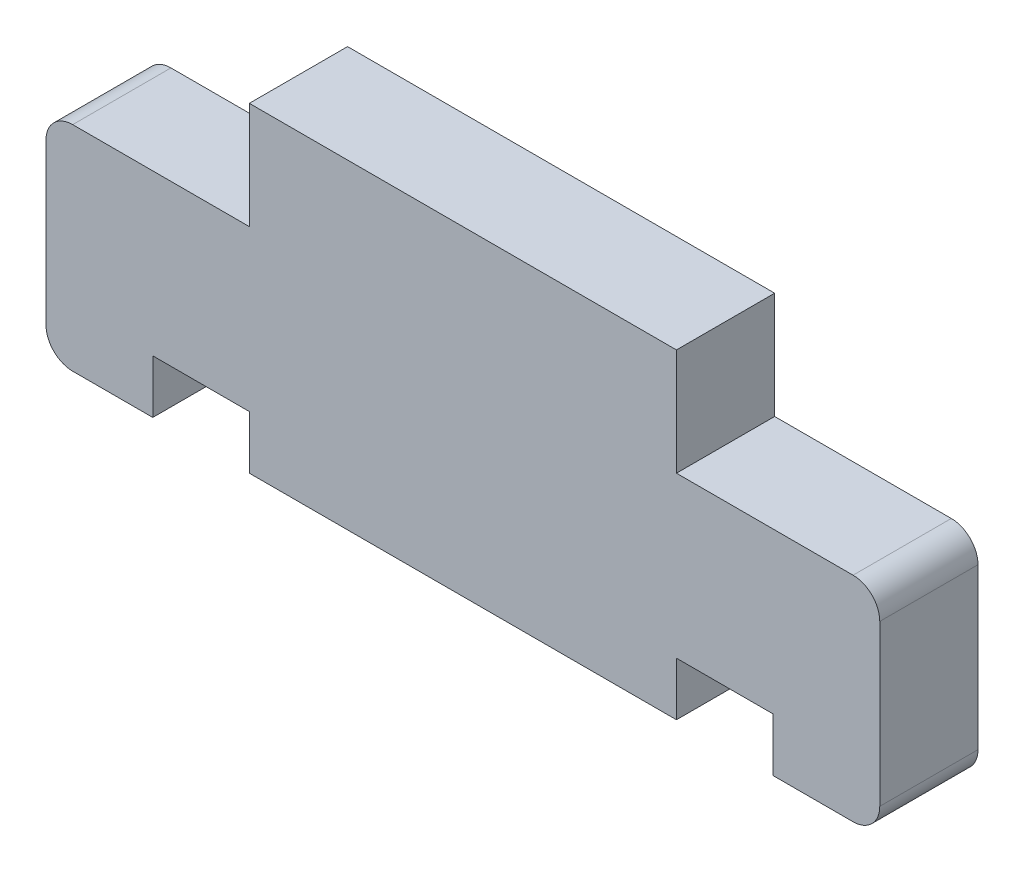
ISO-10303-21;
HEADER;
FILE_DESCRIPTION(('STEP AP214'),'2;1');
FILE_NAME('part.step','',(''),(''),'','','');
FILE_SCHEMA(('AUTOMOTIVE_DESIGN { 1 0 10303 214 1 1 1 1 }'));
ENDSEC;
DATA;
#1=APPLICATION_CONTEXT('core data for automotive mechanical design processes');
#2=APPLICATION_PROTOCOL_DEFINITION('international standard','automotive_design',2000,#1);
#3=PRODUCT_CONTEXT('',#1,'mechanical');
#4=PRODUCT('Part','Part','',(#3));
#5=PRODUCT_RELATED_PRODUCT_CATEGORY('part','',(#4));
#6=PRODUCT_DEFINITION_FORMATION('','',#4);
#7=PRODUCT_DEFINITION_CONTEXT('part definition',#1,'design');
#8=PRODUCT_DEFINITION('design','',#6,#7);
#9=PRODUCT_DEFINITION_SHAPE('','',#8);
#10=(LENGTH_UNIT() NAMED_UNIT(*) SI_UNIT(.MILLI.,.METRE.));
#11=(NAMED_UNIT(*) PLANE_ANGLE_UNIT() SI_UNIT($,.RADIAN.));
#12=(NAMED_UNIT(*) SI_UNIT($,.STERADIAN.) SOLID_ANGLE_UNIT());
#13=UNCERTAINTY_MEASURE_WITH_UNIT(LENGTH_MEASURE(1.E-05),#10,'distance_accuracy_value','');
#14=(GEOMETRIC_REPRESENTATION_CONTEXT(3) GLOBAL_UNCERTAINTY_ASSIGNED_CONTEXT((#13)) GLOBAL_UNIT_ASSIGNED_CONTEXT((#10,
#11,#12)) REPRESENTATION_CONTEXT('',''));
#15=CARTESIAN_POINT('',(0.,0.,0.));
#16=DIRECTION('',(0.,0.,1.));
#17=DIRECTION('',(1.,0.,0.));
#18=AXIS2_PLACEMENT_3D('',#15,#16,#17);
#19=CARTESIAN_POINT('',(-12.7,3.175,5.842));
#20=DIRECTION('',(1.,0.,0.));
#21=DIRECTION('',(0.,0.,-1.));
#22=AXIS2_PLACEMENT_3D('',#19,#20,#21);
#23=PLANE('',#22);
#24=DIRECTION('',(0.,-1.,0.));
#25=VECTOR('',#24,1.);
#26=CARTESIAN_POINT('',(-12.7,3.175,0.));
#27=LINE('',#26,#25);
#28=CARTESIAN_POINT('',(-12.7,9.525,0.));
#29=VERTEX_POINT('',#28);
#30=CARTESIAN_POINT('',(-12.7,3.175,0.));
#31=VERTEX_POINT('',#30);
#32=EDGE_CURVE('E197',#29,#31,#27,.T.);
#33=ORIENTED_EDGE('',*,*,#32,.T.);
#34=DIRECTION('',(0.,0.,-1.));
#35=VECTOR('',#34,1.);
#36=CARTESIAN_POINT('',(-12.7,3.175,5.842));
#37=LINE('',#36,#35);
#38=CARTESIAN_POINT('',(-12.7,3.175,5.842));
#39=VERTEX_POINT('',#38);
#40=EDGE_CURVE('E179',#39,#31,#37,.T.);
#41=ORIENTED_EDGE('',*,*,#40,.F.);
#42=DIRECTION('',(0.,-1.,0.));
#43=VECTOR('',#42,1.);
#44=CARTESIAN_POINT('',(-12.7,3.175,5.842));
#45=LINE('',#44,#43);
#46=CARTESIAN_POINT('',(-12.7,9.525,5.842));
#47=VERTEX_POINT('',#46);
#48=EDGE_CURVE('E185',#47,#39,#45,.T.);
#49=ORIENTED_EDGE('',*,*,#48,.F.);
#50=DIRECTION('',(0.,0.,-1.));
#51=VECTOR('',#50,1.);
#52=CARTESIAN_POINT('',(-12.7,9.525,5.842));
#53=LINE('',#52,#51);
#54=EDGE_CURVE('E268',#47,#29,#53,.T.);
#55=ORIENTED_EDGE('',*,*,#54,.T.);
#56=EDGE_LOOP('',(#33,#41,#49,#55));
#57=FACE_BOUND('',#56,.T.);
#58=ADVANCED_FACE('F35',(#57),#23,.F.);
#59=CARTESIAN_POINT('',(-24.792,3.175,5.842));
#60=DIRECTION('',(0.,-1.,0.));
#61=DIRECTION('',(1.,0.,0.));
#62=AXIS2_PLACEMENT_3D('',#59,#60,#61);
#63=PLANE('',#62);
#64=DIRECTION('',(-1.,0.,0.));
#65=VECTOR('',#64,1.);
#66=CARTESIAN_POINT('',(-24.792,3.175,0.));
#67=LINE('',#66,#65);
#68=CARTESIAN_POINT('',(-23.2045,3.175,0.));
#69=VERTEX_POINT('',#68);
#70=EDGE_CURVE('E361',#31,#69,#67,.T.);
#71=ORIENTED_EDGE('',*,*,#70,.T.);
#72=DIRECTION('',(0.,0.,-1.));
#73=VECTOR('',#72,1.);
#74=CARTESIAN_POINT('',(-23.2045,3.175,5.842));
#75=LINE('',#74,#73);
#76=CARTESIAN_POINT('',(-23.2045,3.175,5.842));
#77=VERTEX_POINT('',#76);
#78=EDGE_CURVE('E182',#69,#77,#75,.F.);
#79=ORIENTED_EDGE('',*,*,#78,.T.);
#80=DIRECTION('',(-1.,0.,0.));
#81=VECTOR('',#80,1.);
#82=CARTESIAN_POINT('',(-18.442,3.175,5.842));
#83=LINE('',#82,#81);
#84=EDGE_CURVE('E174',#39,#77,#83,.T.);
#85=ORIENTED_EDGE('',*,*,#84,.F.);
#86=ORIENTED_EDGE('',*,*,#40,.T.);
#87=EDGE_LOOP('',(#71,#79,#85,#86));
#88=FACE_BOUND('',#87,.T.);
#89=ADVANCED_FACE('F177',(#88),#63,.F.);
#90=CARTESIAN_POINT('',(-24.792,-9.52499999999999,5.842));
#91=DIRECTION('',(1.,0.,0.));
#92=DIRECTION('',(0.,0.,-1.));
#93=AXIS2_PLACEMENT_3D('',#90,#91,#92);
#94=PLANE('',#93);
#95=DIRECTION('',(0.,-1.,0.));
#96=VECTOR('',#95,1.);
#97=CARTESIAN_POINT('',(-24.792,-9.52499999999999,5.842));
#98=LINE('',#97,#96);
#99=CARTESIAN_POINT('',(-24.792,1.5875,5.842));
#100=VERTEX_POINT('',#99);
#101=CARTESIAN_POINT('',(-24.792,-7.93749999999999,5.842));
#102=VERTEX_POINT('',#101);
#103=EDGE_CURVE('E184',#100,#102,#98,.T.);
#104=ORIENTED_EDGE('',*,*,#103,.F.);
#105=DIRECTION('',(0.,0.,-1.));
#106=VECTOR('',#105,1.);
#107=CARTESIAN_POINT('',(-24.792,1.5875,5.842));
#108=LINE('',#107,#106);
#109=CARTESIAN_POINT('',(-24.792,1.5875,0.));
#110=VERTEX_POINT('',#109);
#111=EDGE_CURVE('E201',#100,#110,#108,.T.);
#112=ORIENTED_EDGE('',*,*,#111,.T.);
#113=DIRECTION('',(0.,-1.,0.));
#114=VECTOR('',#113,1.);
#115=CARTESIAN_POINT('',(-24.792,-9.52499999999999,0.));
#116=LINE('',#115,#114);
#117=CARTESIAN_POINT('',(-24.792,-7.93749999999999,0.));
#118=VERTEX_POINT('',#117);
#119=EDGE_CURVE('E363',#110,#118,#116,.T.);
#120=ORIENTED_EDGE('',*,*,#119,.T.);
#121=DIRECTION('',(0.,0.,-1.));
#122=VECTOR('',#121,1.);
#123=CARTESIAN_POINT('',(-24.792,-7.93749999999999,5.842));
#124=LINE('',#123,#122);
#125=EDGE_CURVE('E198',#118,#102,#124,.F.);
#126=ORIENTED_EDGE('',*,*,#125,.T.);
#127=EDGE_LOOP('',(#104,#112,#120,#126));
#128=FACE_BOUND('',#127,.T.);
#129=ADVANCED_FACE('F382',(#128),#94,.F.);
#130=CARTESIAN_POINT('',(-24.792,-9.52499999999999,5.842));
#131=DIRECTION('',(0.,1.,0.));
#132=DIRECTION('',(0.,0.,1.));
#133=AXIS2_PLACEMENT_3D('',#130,#131,#132);
#134=PLANE('',#133);
#135=DIRECTION('',(1.,0.,0.));
#136=VECTOR('',#135,1.);
#137=CARTESIAN_POINT('',(-24.792,-9.52499999999999,5.842));
#138=LINE('',#137,#136);
#139=CARTESIAN_POINT('',(-23.2045,-9.52499999999999,5.842));
#140=VERTEX_POINT('',#139);
#141=CARTESIAN_POINT('',(-18.442,-9.52499999999999,5.842));
#142=VERTEX_POINT('',#141);
#143=EDGE_CURVE('E371',#140,#142,#138,.T.);
#144=ORIENTED_EDGE('',*,*,#143,.F.);
#145=DIRECTION('',(0.,0.,-1.));
#146=VECTOR('',#145,1.);
#147=CARTESIAN_POINT('',(-23.2045,-9.52499999999999,5.842));
#148=LINE('',#147,#146);
#149=CARTESIAN_POINT('',(-23.2045,-9.52499999999999,0.));
#150=VERTEX_POINT('',#149);
#151=EDGE_CURVE('E226',#140,#150,#148,.T.);
#152=ORIENTED_EDGE('',*,*,#151,.T.);
#153=DIRECTION('',(1.,0.,0.));
#154=VECTOR('',#153,1.);
#155=CARTESIAN_POINT('',(-24.792,-9.52499999999999,0.));
#156=LINE('',#155,#154);
#157=CARTESIAN_POINT('',(-18.442,-9.52499999999999,0.));
#158=VERTEX_POINT('',#157);
#159=EDGE_CURVE('E312',#150,#158,#156,.T.);
#160=ORIENTED_EDGE('',*,*,#159,.T.);
#161=DIRECTION('',(0.,0.,-1.));
#162=VECTOR('',#161,1.);
#163=CARTESIAN_POINT('',(-18.442,-9.52499999999999,5.842));
#164=LINE('',#163,#162);
#165=EDGE_CURVE('E199',#142,#158,#164,.T.);
#166=ORIENTED_EDGE('',*,*,#165,.F.);
#167=EDGE_LOOP('',(#144,#152,#160,#166));
#168=FACE_BOUND('',#167,.T.);
#169=ADVANCED_FACE('F368',(#168),#134,.F.);
#170=CARTESIAN_POINT('',(-18.442,-9.52499999999999,5.842));
#171=DIRECTION('',(-1.,0.,0.));
#172=DIRECTION('',(0.,0.,1.));
#173=AXIS2_PLACEMENT_3D('',#170,#171,#172);
#174=PLANE('',#173);
#175=DIRECTION('',(0.,1.,0.));
#176=VECTOR('',#175,1.);
#177=CARTESIAN_POINT('',(-18.442,-9.52499999999999,0.));
#178=LINE('',#177,#176);
#179=CARTESIAN_POINT('',(-18.442,-6.34999999999999,0.));
#180=VERTEX_POINT('',#179);
#181=EDGE_CURVE('E306',#158,#180,#178,.T.);
#182=ORIENTED_EDGE('',*,*,#181,.T.);
#183=DIRECTION('',(0.,0.,-1.));
#184=VECTOR('',#183,1.);
#185=CARTESIAN_POINT('',(-18.442,-6.34999999999999,5.842));
#186=LINE('',#185,#184);
#187=CARTESIAN_POINT('',(-18.442,-6.34999999999999,5.842));
#188=VERTEX_POINT('',#187);
#189=EDGE_CURVE('E204',#188,#180,#186,.T.);
#190=ORIENTED_EDGE('',*,*,#189,.F.);
#191=DIRECTION('',(0.,1.,0.));
#192=VECTOR('',#191,1.);
#193=CARTESIAN_POINT('',(-18.442,-9.52499999999999,5.842));
#194=LINE('',#193,#192);
#195=EDGE_CURVE('E347',#142,#188,#194,.T.);
#196=ORIENTED_EDGE('',*,*,#195,.F.);
#197=ORIENTED_EDGE('',*,*,#165,.T.);
#198=EDGE_LOOP('',(#182,#190,#196,#197));
#199=FACE_BOUND('',#198,.T.);
#200=ADVANCED_FACE('F370',(#199),#174,.F.);
#201=CARTESIAN_POINT('',(-18.442,-6.34999999999999,5.842));
#202=DIRECTION('',(0.,1.,0.));
#203=DIRECTION('',(0.,0.,1.));
#204=AXIS2_PLACEMENT_3D('',#201,#202,#203);
#205=PLANE('',#204);
#206=DIRECTION('',(1.,0.,0.));
#207=VECTOR('',#206,1.);
#208=CARTESIAN_POINT('',(-18.442,-6.34999999999999,0.));
#209=LINE('',#208,#207);
#210=CARTESIAN_POINT('',(-12.7,-6.34999999999999,0.));
#211=VERTEX_POINT('',#210);
#212=EDGE_CURVE('E299',#180,#211,#209,.T.);
#213=ORIENTED_EDGE('',*,*,#212,.T.);
#214=DIRECTION('',(0.,0.,-1.));
#215=VECTOR('',#214,1.);
#216=CARTESIAN_POINT('',(-12.7,-6.34999999999999,5.842));
#217=LINE('',#216,#215);
#218=CARTESIAN_POINT('',(-12.7,-6.34999999999999,5.842));
#219=VERTEX_POINT('',#218);
#220=EDGE_CURVE('E290',#219,#211,#217,.T.);
#221=ORIENTED_EDGE('',*,*,#220,.F.);
#222=DIRECTION('',(1.,0.,0.));
#223=VECTOR('',#222,1.);
#224=CARTESIAN_POINT('',(-18.442,-6.34999999999999,5.842));
#225=LINE('',#224,#223);
#226=EDGE_CURVE('E300',#188,#219,#225,.T.);
#227=ORIENTED_EDGE('',*,*,#226,.F.);
#228=ORIENTED_EDGE('',*,*,#189,.T.);
#229=EDGE_LOOP('',(#213,#221,#227,#228));
#230=FACE_BOUND('',#229,.T.);
#231=ADVANCED_FACE('F297',(#230),#205,.F.);
#232=CARTESIAN_POINT('',(-12.7,-9.525,5.842));
#233=DIRECTION('',(1.,0.,0.));
#234=DIRECTION('',(0.,0.,-1.));
#235=AXIS2_PLACEMENT_3D('',#232,#233,#234);
#236=PLANE('',#235);
#237=DIRECTION('',(0.,-1.,0.));
#238=VECTOR('',#237,1.);
#239=CARTESIAN_POINT('',(-12.7,-9.525,0.));
#240=LINE('',#239,#238);
#241=CARTESIAN_POINT('',(-12.7,-9.525,0.));
#242=VERTEX_POINT('',#241);
#243=EDGE_CURVE('E308',#211,#242,#240,.T.);
#244=ORIENTED_EDGE('',*,*,#243,.T.);
#245=DIRECTION('',(0.,0.,-1.));
#246=VECTOR('',#245,1.);
#247=CARTESIAN_POINT('',(-12.7,-9.525,5.842));
#248=LINE('',#247,#246);
#249=CARTESIAN_POINT('',(-12.7,-9.525,5.842));
#250=VERTEX_POINT('',#249);
#251=EDGE_CURVE('E287',#250,#242,#248,.T.);
#252=ORIENTED_EDGE('',*,*,#251,.F.);
#253=DIRECTION('',(0.,-1.,0.));
#254=VECTOR('',#253,1.);
#255=CARTESIAN_POINT('',(-12.7,-9.525,5.842));
#256=LINE('',#255,#254);
#257=EDGE_CURVE('E344',#219,#250,#256,.T.);
#258=ORIENTED_EDGE('',*,*,#257,.F.);
#259=ORIENTED_EDGE('',*,*,#220,.T.);
#260=EDGE_LOOP('',(#244,#252,#258,#259));
#261=FACE_BOUND('',#260,.T.);
#262=ADVANCED_FACE('F343',(#261),#236,.F.);
#263=CARTESIAN_POINT('',(12.7,-9.525,5.842));
#264=DIRECTION('',(0.,1.,0.));
#265=DIRECTION('',(-1.,0.,0.));
#266=AXIS2_PLACEMENT_3D('',#263,#264,#265);
#267=PLANE('',#266);
#268=DIRECTION('',(1.,0.,0.));
#269=VECTOR('',#268,1.);
#270=CARTESIAN_POINT('',(12.7,-9.525,0.));
#271=LINE('',#270,#269);
#272=CARTESIAN_POINT('',(12.7,-9.525,0.));
#273=VERTEX_POINT('',#272);
#274=EDGE_CURVE('E310',#242,#273,#271,.T.);
#275=ORIENTED_EDGE('',*,*,#274,.T.);
#276=DIRECTION('',(0.,0.,-1.));
#277=VECTOR('',#276,1.);
#278=CARTESIAN_POINT('',(12.7,-9.525,5.842));
#279=LINE('',#278,#277);
#280=CARTESIAN_POINT('',(12.7,-9.525,5.842));
#281=VERTEX_POINT('',#280);
#282=EDGE_CURVE('E284',#281,#273,#279,.T.);
#283=ORIENTED_EDGE('',*,*,#282,.F.);
#284=DIRECTION('',(1.,0.,0.));
#285=VECTOR('',#284,1.);
#286=CARTESIAN_POINT('',(12.7,-9.525,5.842));
#287=LINE('',#286,#285);
#288=EDGE_CURVE('E339',#250,#281,#287,.T.);
#289=ORIENTED_EDGE('',*,*,#288,.F.);
#290=ORIENTED_EDGE('',*,*,#251,.T.);
#291=EDGE_LOOP('',(#275,#283,#289,#290));
#292=FACE_BOUND('',#291,.T.);
#293=ADVANCED_FACE('F338',(#292),#267,.F.);
#294=CARTESIAN_POINT('',(12.7,-9.525,5.842));
#295=DIRECTION('',(-1.,0.,0.));
#296=DIRECTION('',(0.,0.,1.));
#297=AXIS2_PLACEMENT_3D('',#294,#295,#296);
#298=PLANE('',#297);
#299=DIRECTION('',(0.,1.,0.));
#300=VECTOR('',#299,1.);
#301=CARTESIAN_POINT('',(12.7,-9.525,0.));
#302=LINE('',#301,#300);
#303=CARTESIAN_POINT('',(12.7,-6.35,0.));
#304=VERTEX_POINT('',#303);
#305=EDGE_CURVE('E317',#273,#304,#302,.T.);
#306=ORIENTED_EDGE('',*,*,#305,.T.);
#307=DIRECTION('',(0.,0.,-1.));
#308=VECTOR('',#307,1.);
#309=CARTESIAN_POINT('',(12.7,-6.35,5.842));
#310=LINE('',#309,#308);
#311=CARTESIAN_POINT('',(12.7,-6.35,5.842));
#312=VERTEX_POINT('',#311);
#313=EDGE_CURVE('E281',#312,#304,#310,.T.);
#314=ORIENTED_EDGE('',*,*,#313,.F.);
#315=DIRECTION('',(0.,1.,0.));
#316=VECTOR('',#315,1.);
#317=CARTESIAN_POINT('',(12.7,-9.525,5.842));
#318=LINE('',#317,#316);
#319=EDGE_CURVE('E334',#281,#312,#318,.T.);
#320=ORIENTED_EDGE('',*,*,#319,.F.);
#321=ORIENTED_EDGE('',*,*,#282,.T.);
#322=EDGE_LOOP('',(#306,#314,#320,#321));
#323=FACE_BOUND('',#322,.T.);
#324=ADVANCED_FACE('F333',(#323),#298,.F.);
#325=CARTESIAN_POINT('',(18.442,-6.35,5.842));
#326=DIRECTION('',(0.,1.,0.));
#327=DIRECTION('',(0.,0.,1.));
#328=AXIS2_PLACEMENT_3D('',#325,#326,#327);
#329=PLANE('',#328);
#330=DIRECTION('',(1.,0.,0.));
#331=VECTOR('',#330,1.);
#332=CARTESIAN_POINT('',(18.442,-6.35,0.));
#333=LINE('',#332,#331);
#334=CARTESIAN_POINT('',(18.442,-6.35,0.));
#335=VERTEX_POINT('',#334);
#336=EDGE_CURVE('E319',#304,#335,#333,.T.);
#337=ORIENTED_EDGE('',*,*,#336,.T.);
#338=DIRECTION('',(0.,0.,-1.));
#339=VECTOR('',#338,1.);
#340=CARTESIAN_POINT('',(18.442,-6.35,5.842));
#341=LINE('',#340,#339);
#342=CARTESIAN_POINT('',(18.442,-6.35,5.842));
#343=VERTEX_POINT('',#342);
#344=EDGE_CURVE('E278',#343,#335,#341,.T.);
#345=ORIENTED_EDGE('',*,*,#344,.F.);
#346=DIRECTION('',(1.,0.,0.));
#347=VECTOR('',#346,1.);
#348=CARTESIAN_POINT('',(18.442,-6.35,5.842));
#349=LINE('',#348,#347);
#350=EDGE_CURVE('E330',#312,#343,#349,.T.);
#351=ORIENTED_EDGE('',*,*,#350,.F.);
#352=ORIENTED_EDGE('',*,*,#313,.T.);
#353=EDGE_LOOP('',(#337,#345,#351,#352));
#354=FACE_BOUND('',#353,.T.);
#355=ADVANCED_FACE('F327',(#354),#329,.F.);
#356=CARTESIAN_POINT('',(18.442,-9.525,5.842));
#357=DIRECTION('',(1.,0.,0.));
#358=DIRECTION('',(0.,0.,-1.));
#359=AXIS2_PLACEMENT_3D('',#356,#357,#358);
#360=PLANE('',#359);
#361=DIRECTION('',(0.,-1.,0.));
#362=VECTOR('',#361,1.);
#363=CARTESIAN_POINT('',(18.442,-9.525,0.));
#364=LINE('',#363,#362);
#365=CARTESIAN_POINT('',(18.442,-9.525,0.));
#366=VERTEX_POINT('',#365);
#367=EDGE_CURVE('E262',#335,#366,#364,.T.);
#368=ORIENTED_EDGE('',*,*,#367,.T.);
#369=DIRECTION('',(0.,0.,-1.));
#370=VECTOR('',#369,1.);
#371=CARTESIAN_POINT('',(18.442,-9.525,5.842));
#372=LINE('',#371,#370);
#373=CARTESIAN_POINT('',(18.442,-9.525,5.842));
#374=VERTEX_POINT('',#373);
#375=EDGE_CURVE('E276',#374,#366,#372,.T.);
#376=ORIENTED_EDGE('',*,*,#375,.F.);
#377=DIRECTION('',(0.,-1.,0.));
#378=VECTOR('',#377,1.);
#379=CARTESIAN_POINT('',(18.442,-9.525,5.842));
#380=LINE('',#379,#378);
#381=EDGE_CURVE('E245',#343,#374,#380,.T.);
#382=ORIENTED_EDGE('',*,*,#381,.F.);
#383=ORIENTED_EDGE('',*,*,#344,.T.);
#384=EDGE_LOOP('',(#368,#376,#382,#383));
#385=FACE_BOUND('',#384,.T.);
#386=ADVANCED_FACE('F322',(#385),#360,.F.);
#387=CARTESIAN_POINT('',(24.792,-9.525,5.842));
#388=DIRECTION('',(0.,1.,0.));
#389=DIRECTION('',(0.,0.,1.));
#390=AXIS2_PLACEMENT_3D('',#387,#388,#389);
#391=PLANE('',#390);
#392=DIRECTION('',(1.,0.,0.));
#393=VECTOR('',#392,1.);
#394=CARTESIAN_POINT('',(24.792,-9.525,0.));
#395=LINE('',#394,#393);
#396=CARTESIAN_POINT('',(23.2045,-9.525,0.));
#397=VERTEX_POINT('',#396);
#398=EDGE_CURVE('E241',#366,#397,#395,.T.);
#399=ORIENTED_EDGE('',*,*,#398,.T.);
#400=DIRECTION('',(0.,0.,-1.));
#401=VECTOR('',#400,1.);
#402=CARTESIAN_POINT('',(23.2045,-9.525,5.842));
#403=LINE('',#402,#401);
#404=CARTESIAN_POINT('',(23.2045,-9.525,5.842));
#405=VERTEX_POINT('',#404);
#406=EDGE_CURVE('E43',#397,#405,#403,.F.);
#407=ORIENTED_EDGE('',*,*,#406,.T.);
#408=DIRECTION('',(1.,0.,0.));
#409=VECTOR('',#408,1.);
#410=CARTESIAN_POINT('',(24.792,-9.525,5.842));
#411=LINE('',#410,#409);
#412=EDGE_CURVE('E239',#374,#405,#411,.T.);
#413=ORIENTED_EDGE('',*,*,#412,.F.);
#414=ORIENTED_EDGE('',*,*,#375,.T.);
#415=EDGE_LOOP('',(#399,#407,#413,#414));
#416=FACE_BOUND('',#415,.T.);
#417=ADVANCED_FACE('F237',(#416),#391,.F.);
#418=CARTESIAN_POINT('',(24.792,-9.525,5.842));
#419=DIRECTION('',(-1.,0.,0.));
#420=DIRECTION('',(0.,0.,1.));
#421=AXIS2_PLACEMENT_3D('',#418,#419,#420);
#422=PLANE('',#421);
#423=DIRECTION('',(0.,1.,0.));
#424=VECTOR('',#423,1.);
#425=CARTESIAN_POINT('',(24.792,-9.525,5.842));
#426=LINE('',#425,#424);
#427=CARTESIAN_POINT('',(24.792,-7.9375,5.842));
#428=VERTEX_POINT('',#427);
#429=CARTESIAN_POINT('',(24.792,1.5875,5.842));
#430=VERTEX_POINT('',#429);
#431=EDGE_CURVE('E247',#428,#430,#426,.T.);
#432=ORIENTED_EDGE('',*,*,#431,.F.);
#433=DIRECTION('',(0.,0.,-1.));
#434=VECTOR('',#433,1.);
#435=CARTESIAN_POINT('',(24.792,-7.9375,5.842));
#436=LINE('',#435,#434);
#437=CARTESIAN_POINT('',(24.792,-7.9375,0.));
#438=VERTEX_POINT('',#437);
#439=EDGE_CURVE('E230',#428,#438,#436,.T.);
#440=ORIENTED_EDGE('',*,*,#439,.T.);
#441=DIRECTION('',(0.,1.,0.));
#442=VECTOR('',#441,1.);
#443=CARTESIAN_POINT('',(24.792,-9.525,0.));
#444=LINE('',#443,#442);
#445=CARTESIAN_POINT('',(24.792,1.5875,0.));
#446=VERTEX_POINT('',#445);
#447=EDGE_CURVE('E253',#438,#446,#444,.T.);
#448=ORIENTED_EDGE('',*,*,#447,.T.);
#449=DIRECTION('',(0.,0.,-1.));
#450=VECTOR('',#449,1.);
#451=CARTESIAN_POINT('',(24.792,1.5875,5.842));
#452=LINE('',#451,#450);
#453=EDGE_CURVE('E58',#446,#430,#452,.F.);
#454=ORIENTED_EDGE('',*,*,#453,.T.);
#455=EDGE_LOOP('',(#432,#440,#448,#454));
#456=FACE_BOUND('',#455,.T.);
#457=ADVANCED_FACE('F252',(#456),#422,.F.);
#458=CARTESIAN_POINT('',(18.442,3.175,5.842));
#459=DIRECTION('',(0.,-1.,0.));
#460=DIRECTION('',(0.,0.,-1.));
#461=AXIS2_PLACEMENT_3D('',#458,#459,#460);
#462=PLANE('',#461);
#463=DIRECTION('',(-1.,0.,0.));
#464=VECTOR('',#463,1.);
#465=CARTESIAN_POINT('',(24.792,3.175,5.842));
#466=LINE('',#465,#464);
#467=CARTESIAN_POINT('',(23.2045,3.175,5.842));
#468=VERTEX_POINT('',#467);
#469=CARTESIAN_POINT('',(12.7,3.175,5.842));
#470=VERTEX_POINT('',#469);
#471=EDGE_CURVE('E355',#468,#470,#466,.T.);
#472=ORIENTED_EDGE('',*,*,#471,.F.);
#473=DIRECTION('',(0.,0.,-1.));
#474=VECTOR('',#473,1.);
#475=CARTESIAN_POINT('',(23.2045,3.175,5.842));
#476=LINE('',#475,#474);
#477=CARTESIAN_POINT('',(23.2045,3.175,0.));
#478=VERTEX_POINT('',#477);
#479=EDGE_CURVE('E11',#468,#478,#476,.T.);
#480=ORIENTED_EDGE('',*,*,#479,.T.);
#481=DIRECTION('',(-1.,0.,0.));
#482=VECTOR('',#481,1.);
#483=CARTESIAN_POINT('',(18.442,3.175,0.));
#484=LINE('',#483,#482);
#485=CARTESIAN_POINT('',(12.7,3.175,0.));
#486=VERTEX_POINT('',#485);
#487=EDGE_CURVE('E258',#478,#486,#484,.T.);
#488=ORIENTED_EDGE('',*,*,#487,.T.);
#489=DIRECTION('',(0.,0.,-1.));
#490=VECTOR('',#489,1.);
#491=CARTESIAN_POINT('',(12.7,3.175,5.842));
#492=LINE('',#491,#490);
#493=EDGE_CURVE('E273',#470,#486,#492,.T.);
#494=ORIENTED_EDGE('',*,*,#493,.F.);
#495=EDGE_LOOP('',(#472,#480,#488,#494));
#496=FACE_BOUND('',#495,.T.);
#497=ADVANCED_FACE('F395',(#496),#462,.F.);
#498=CARTESIAN_POINT('',(12.7,3.175,5.842));
#499=DIRECTION('',(-1.,0.,0.));
#500=DIRECTION('',(0.,0.,1.));
#501=AXIS2_PLACEMENT_3D('',#498,#499,#500);
#502=PLANE('',#501);
#503=DIRECTION('',(0.,1.,0.));
#504=VECTOR('',#503,1.);
#505=CARTESIAN_POINT('',(12.7,3.175,0.));
#506=LINE('',#505,#504);
#507=CARTESIAN_POINT('',(12.7,9.525,0.));
#508=VERTEX_POINT('',#507);
#509=EDGE_CURVE('E260',#486,#508,#506,.T.);
#510=ORIENTED_EDGE('',*,*,#509,.T.);
#511=DIRECTION('',(0.,0.,-1.));
#512=VECTOR('',#511,1.);
#513=CARTESIAN_POINT('',(12.7,9.525,5.842));
#514=LINE('',#513,#512);
#515=CARTESIAN_POINT('',(12.7,9.525,5.842));
#516=VERTEX_POINT('',#515);
#517=EDGE_CURVE('E270',#516,#508,#514,.T.);
#518=ORIENTED_EDGE('',*,*,#517,.F.);
#519=DIRECTION('',(0.,1.,0.));
#520=VECTOR('',#519,1.);
#521=CARTESIAN_POINT('',(12.7,3.175,5.842));
#522=LINE('',#521,#520);
#523=EDGE_CURVE('E357',#470,#516,#522,.T.);
#524=ORIENTED_EDGE('',*,*,#523,.F.);
#525=ORIENTED_EDGE('',*,*,#493,.T.);
#526=EDGE_LOOP('',(#510,#518,#524,#525));
#527=FACE_BOUND('',#526,.T.);
#528=ADVANCED_FACE('F392',(#527),#502,.F.);
#529=CARTESIAN_POINT('',(12.7,9.525,5.842));
#530=DIRECTION('',(0.,-1.,0.));
#531=DIRECTION('',(1.,0.,0.));
#532=AXIS2_PLACEMENT_3D('',#529,#530,#531);
#533=PLANE('',#532);
#534=DIRECTION('',(-1.,0.,0.));
#535=VECTOR('',#534,1.);
#536=CARTESIAN_POINT('',(12.7,9.525,0.));
#537=LINE('',#536,#535);
#538=EDGE_CURVE('E194',#508,#29,#537,.T.);
#539=ORIENTED_EDGE('',*,*,#538,.T.);
#540=ORIENTED_EDGE('',*,*,#54,.F.);
#541=DIRECTION('',(-1.,0.,0.));
#542=VECTOR('',#541,1.);
#543=CARTESIAN_POINT('',(12.7,9.525,5.842));
#544=LINE('',#543,#542);
#545=EDGE_CURVE('E190',#516,#47,#544,.T.);
#546=ORIENTED_EDGE('',*,*,#545,.F.);
#547=ORIENTED_EDGE('',*,*,#517,.T.);
#548=EDGE_LOOP('',(#539,#540,#546,#547));
#549=FACE_BOUND('',#548,.T.);
#550=ADVANCED_FACE('F388',(#549),#533,.F.);
#551=CARTESIAN_POINT('',(0.,0.,5.842));
#552=DIRECTION('',(0.,0.,1.));
#553=DIRECTION('',(1.,0.,0.));
#554=AXIS2_PLACEMENT_3D('',#551,#552,#553);
#555=PLANE('',#554);
#556=ORIENTED_EDGE('',*,*,#84,.T.);
#557=CARTESIAN_POINT('',(-23.2045,1.5875,5.842));
#558=DIRECTION('',(0.,0.,1.));
#559=DIRECTION('',(1.,0.,0.));
#560=AXIS2_PLACEMENT_3D('',#557,#558,#559);
#561=CIRCLE('',#560,1.5875);
#562=EDGE_CURVE('E224',#77,#100,#561,.T.);
#563=ORIENTED_EDGE('',*,*,#562,.T.);
#564=ORIENTED_EDGE('',*,*,#103,.T.);
#565=CARTESIAN_POINT('',(-23.2045,-7.93749999999999,5.842));
#566=DIRECTION('',(0.,0.,1.));
#567=DIRECTION('',(1.,0.,0.));
#568=AXIS2_PLACEMENT_3D('',#565,#566,#567);
#569=CIRCLE('',#568,1.5875);
#570=EDGE_CURVE('E222',#102,#140,#569,.T.);
#571=ORIENTED_EDGE('',*,*,#570,.T.);
#572=ORIENTED_EDGE('',*,*,#143,.T.);
#573=ORIENTED_EDGE('',*,*,#195,.T.);
#574=ORIENTED_EDGE('',*,*,#226,.T.);
#575=ORIENTED_EDGE('',*,*,#257,.T.);
#576=ORIENTED_EDGE('',*,*,#288,.T.);
#577=ORIENTED_EDGE('',*,*,#319,.T.);
#578=ORIENTED_EDGE('',*,*,#350,.T.);
#579=ORIENTED_EDGE('',*,*,#381,.T.);
#580=ORIENTED_EDGE('',*,*,#412,.T.);
#581=CARTESIAN_POINT('',(23.2045,-7.9375,5.842));
#582=DIRECTION('',(0.,0.,1.));
#583=DIRECTION('',(1.,0.,0.));
#584=AXIS2_PLACEMENT_3D('',#581,#582,#583);
#585=CIRCLE('',#584,1.5875);
#586=EDGE_CURVE('E220',#405,#428,#585,.T.);
#587=ORIENTED_EDGE('',*,*,#586,.T.);
#588=ORIENTED_EDGE('',*,*,#431,.T.);
#589=CARTESIAN_POINT('',(23.2045,1.5875,5.842));
#590=DIRECTION('',(0.,0.,1.));
#591=DIRECTION('',(1.,0.,0.));
#592=AXIS2_PLACEMENT_3D('',#589,#590,#591);
#593=CIRCLE('',#592,1.5875);
#594=EDGE_CURVE('E50',#430,#468,#593,.T.);
#595=ORIENTED_EDGE('',*,*,#594,.T.);
#596=ORIENTED_EDGE('',*,*,#471,.T.);
#597=ORIENTED_EDGE('',*,*,#523,.T.);
#598=ORIENTED_EDGE('',*,*,#545,.T.);
#599=ORIENTED_EDGE('',*,*,#48,.T.);
#600=EDGE_LOOP('',(#556,#563,#564,#571,#572,#573,#574,#575,#576,#577,#578,#579,#580,#587,#588,
#595,#596,#597,#598,#599));
#601=FACE_BOUND('',#600,.T.);
#602=ADVANCED_FACE('F188',(#601),#555,.T.);
#603=CARTESIAN_POINT('',(0.,0.,0.));
#604=DIRECTION('',(0.,0.,1.));
#605=DIRECTION('',(1.,0.,0.));
#606=AXIS2_PLACEMENT_3D('',#603,#604,#605);
#607=PLANE('',#606);
#608=ORIENTED_EDGE('',*,*,#119,.F.);
#609=CARTESIAN_POINT('',(-23.2045,1.5875,0.));
#610=DIRECTION('',(0.,0.,1.));
#611=DIRECTION('',(1.,0.,0.));
#612=AXIS2_PLACEMENT_3D('',#609,#610,#611);
#613=CIRCLE('',#612,1.5875);
#614=EDGE_CURVE('E216',#110,#69,#613,.F.);
#615=ORIENTED_EDGE('',*,*,#614,.T.);
#616=ORIENTED_EDGE('',*,*,#70,.F.);
#617=ORIENTED_EDGE('',*,*,#32,.F.);
#618=ORIENTED_EDGE('',*,*,#538,.F.);
#619=ORIENTED_EDGE('',*,*,#509,.F.);
#620=ORIENTED_EDGE('',*,*,#487,.F.);
#621=CARTESIAN_POINT('',(23.2045,1.5875,0.));
#622=DIRECTION('',(0.,0.,1.));
#623=DIRECTION('',(1.,0.,0.));
#624=AXIS2_PLACEMENT_3D('',#621,#622,#623);
#625=CIRCLE('',#624,1.5875);
#626=EDGE_CURVE('E210',#478,#446,#625,.F.);
#627=ORIENTED_EDGE('',*,*,#626,.T.);
#628=ORIENTED_EDGE('',*,*,#447,.F.);
#629=CARTESIAN_POINT('',(23.2045,-7.9375,0.));
#630=DIRECTION('',(0.,0.,1.));
#631=DIRECTION('',(1.,0.,0.));
#632=AXIS2_PLACEMENT_3D('',#629,#630,#631);
#633=CIRCLE('',#632,1.5875);
#634=EDGE_CURVE('E212',#438,#397,#633,.F.);
#635=ORIENTED_EDGE('',*,*,#634,.T.);
#636=ORIENTED_EDGE('',*,*,#398,.F.);
#637=ORIENTED_EDGE('',*,*,#367,.F.);
#638=ORIENTED_EDGE('',*,*,#336,.F.);
#639=ORIENTED_EDGE('',*,*,#305,.F.);
#640=ORIENTED_EDGE('',*,*,#274,.F.);
#641=ORIENTED_EDGE('',*,*,#243,.F.);
#642=ORIENTED_EDGE('',*,*,#212,.F.);
#643=ORIENTED_EDGE('',*,*,#181,.F.);
#644=ORIENTED_EDGE('',*,*,#159,.F.);
#645=CARTESIAN_POINT('',(-23.2045,-7.93749999999999,0.));
#646=DIRECTION('',(0.,0.,1.));
#647=DIRECTION('',(1.,0.,0.));
#648=AXIS2_PLACEMENT_3D('',#645,#646,#647);
#649=CIRCLE('',#648,1.5875);
#650=EDGE_CURVE('E214',#150,#118,#649,.F.);
#651=ORIENTED_EDGE('',*,*,#650,.T.);
#652=EDGE_LOOP('',(#608,#615,#616,#617,#618,#619,#620,#627,#628,#635,#636,#637,#638,#639,#640,
#641,#642,#643,#644,#651));
#653=FACE_BOUND('',#652,.T.);
#654=ADVANCED_FACE('F256',(#653),#607,.F.);
#655=CARTESIAN_POINT('',(-23.2045,1.5875,5.842));
#656=DIRECTION('',(0.,0.,-1.));
#657=DIRECTION('',(-1.,0.,0.));
#658=AXIS2_PLACEMENT_3D('',#655,#656,#657);
#659=CYLINDRICAL_SURFACE('',#658,1.5875);
#660=ORIENTED_EDGE('',*,*,#562,.F.);
#661=ORIENTED_EDGE('',*,*,#78,.F.);
#662=ORIENTED_EDGE('',*,*,#614,.F.);
#663=ORIENTED_EDGE('',*,*,#111,.F.);
#664=EDGE_LOOP('',(#660,#661,#662,#663));
#665=FACE_BOUND('',#664,.T.);
#666=ADVANCED_FACE('F384',(#665),#659,.T.);
#667=CARTESIAN_POINT('',(-23.2045,-7.93749999999999,5.842));
#668=DIRECTION('',(0.,0.,-1.));
#669=DIRECTION('',(-1.,0.,0.));
#670=AXIS2_PLACEMENT_3D('',#667,#668,#669);
#671=CYLINDRICAL_SURFACE('',#670,1.5875);
#672=ORIENTED_EDGE('',*,*,#570,.F.);
#673=ORIENTED_EDGE('',*,*,#125,.F.);
#674=ORIENTED_EDGE('',*,*,#650,.F.);
#675=ORIENTED_EDGE('',*,*,#151,.F.);
#676=EDGE_LOOP('',(#672,#673,#674,#675));
#677=FACE_BOUND('',#676,.T.);
#678=ADVANCED_FACE('F381',(#677),#671,.T.);
#679=CARTESIAN_POINT('',(23.2045,-7.9375,5.842));
#680=DIRECTION('',(0.,0.,-1.));
#681=DIRECTION('',(-1.,0.,0.));
#682=AXIS2_PLACEMENT_3D('',#679,#680,#681);
#683=CYLINDRICAL_SURFACE('',#682,1.5875);
#684=ORIENTED_EDGE('',*,*,#586,.F.);
#685=ORIENTED_EDGE('',*,*,#406,.F.);
#686=ORIENTED_EDGE('',*,*,#634,.F.);
#687=ORIENTED_EDGE('',*,*,#439,.F.);
#688=EDGE_LOOP('',(#684,#685,#686,#687));
#689=FACE_BOUND('',#688,.T.);
#690=ADVANCED_FACE('F250',(#689),#683,.T.);
#691=CARTESIAN_POINT('',(23.2045,1.5875,5.842));
#692=DIRECTION('',(0.,0.,-1.));
#693=DIRECTION('',(-1.,0.,0.));
#694=AXIS2_PLACEMENT_3D('',#691,#692,#693);
#695=CYLINDRICAL_SURFACE('',#694,1.5875);
#696=ORIENTED_EDGE('',*,*,#594,.F.);
#697=ORIENTED_EDGE('',*,*,#453,.F.);
#698=ORIENTED_EDGE('',*,*,#626,.F.);
#699=ORIENTED_EDGE('',*,*,#479,.F.);
#700=EDGE_LOOP('',(#696,#697,#698,#699));
#701=FACE_BOUND('',#700,.T.);
#702=ADVANCED_FACE('F37',(#701),#695,.T.);
#703=CLOSED_SHELL('',(#58,#89,#129,#169,#200,#231,#262,#293,#324,#355,#386,#417,#457,#497,#528,
#550,#602,#654,#666,#678,#690,#702));
#704=MANIFOLD_SOLID_BREP('B2',#703);
#705=ADVANCED_BREP_SHAPE_REPRESENTATION('',(#18,#704),#14);
#706=SHAPE_DEFINITION_REPRESENTATION(#9,#705);
ENDSEC;
END-ISO-10303-21;
